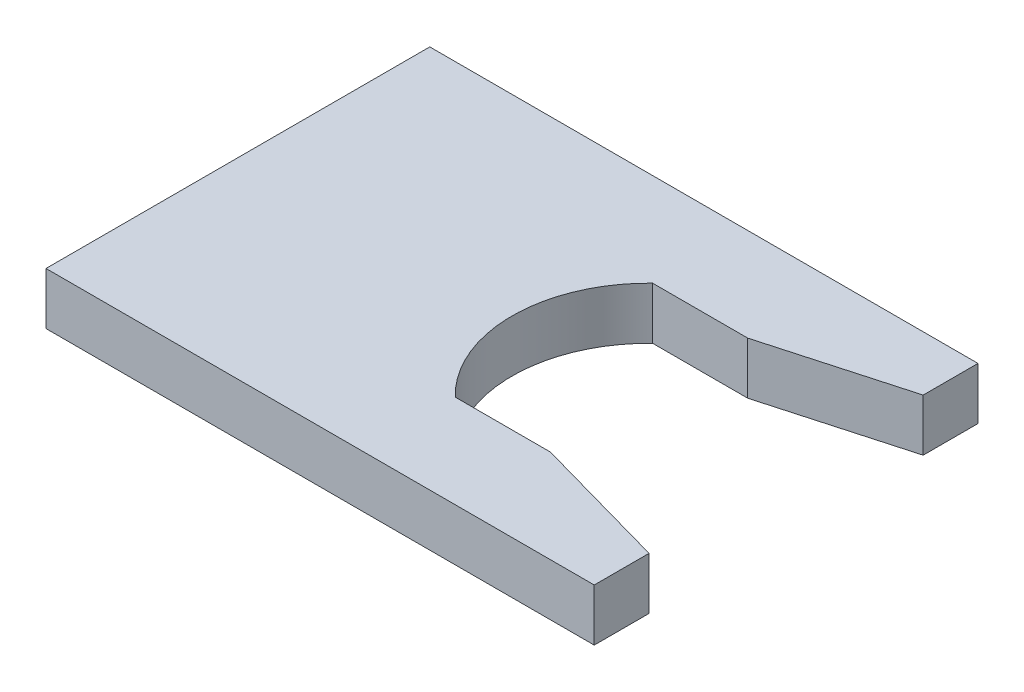
ISO-10303-21;
HEADER;
FILE_DESCRIPTION(('STEP AP214'),'2;1');
FILE_NAME('part.step','',(''),(''),'','','');
FILE_SCHEMA(('AUTOMOTIVE_DESIGN { 1 0 10303 214 1 1 1 1 }'));
ENDSEC;
DATA;
#1=APPLICATION_CONTEXT('core data for automotive mechanical design processes');
#2=APPLICATION_PROTOCOL_DEFINITION('international standard','automotive_design',2000,#1);
#3=PRODUCT_CONTEXT('',#1,'mechanical');
#4=PRODUCT('Part','Part','',(#3));
#5=PRODUCT_RELATED_PRODUCT_CATEGORY('part','',(#4));
#6=PRODUCT_DEFINITION_FORMATION('','',#4);
#7=PRODUCT_DEFINITION_CONTEXT('part definition',#1,'design');
#8=PRODUCT_DEFINITION('design','',#6,#7);
#9=PRODUCT_DEFINITION_SHAPE('','',#8);
#10=(LENGTH_UNIT() NAMED_UNIT(*) SI_UNIT(.MILLI.,.METRE.));
#11=(NAMED_UNIT(*) PLANE_ANGLE_UNIT() SI_UNIT($,.RADIAN.));
#12=(NAMED_UNIT(*) SI_UNIT($,.STERADIAN.) SOLID_ANGLE_UNIT());
#13=UNCERTAINTY_MEASURE_WITH_UNIT(LENGTH_MEASURE(1.E-05),#10,'distance_accuracy_value','');
#14=(GEOMETRIC_REPRESENTATION_CONTEXT(3) GLOBAL_UNCERTAINTY_ASSIGNED_CONTEXT((#13)) GLOBAL_UNIT_ASSIGNED_CONTEXT((#10,
#11,#12)) REPRESENTATION_CONTEXT('',''));
#15=CARTESIAN_POINT('',(0.,0.,0.));
#16=DIRECTION('',(0.,0.,1.));
#17=DIRECTION('',(1.,0.,0.));
#18=AXIS2_PLACEMENT_3D('',#15,#16,#17);
#19=CARTESIAN_POINT('',(3.72529029846191E-07,9.5,0.));
#20=DIRECTION('',(0.,1.,0.));
#21=DIRECTION('',(1.,0.,0.));
#22=AXIS2_PLACEMENT_3D('',#19,#20,#21);
#23=PLANE('',#22);
#24=DIRECTION('',(-0.962964019714182,0.,-0.269629925519971));
#25=VECTOR('',#24,1.);
#26=CARTESIAN_POINT('',(11.0719587946814,9.5,14.1001486264236));
#27=LINE('',#26,#25);
#28=CARTESIAN_POINT('',(50.0000007450581,9.5,25.000000372529));
#29=VERTEX_POINT('',#28);
#30=CARTESIAN_POINT('',(24.9999994145972,9.5,18.));
#31=VERTEX_POINT('',#30);
#32=EDGE_CURVE('E161',#29,#31,#27,.T.);
#33=ORIENTED_EDGE('',*,*,#32,.T.);
#34=DIRECTION('',(-1.,0.,0.));
#35=VECTOR('',#34,1.);
#36=CARTESIAN_POINT('',(25.,9.5,18.));
#37=LINE('',#36,#35);
#38=CARTESIAN_POINT('',(7.65064842710252,9.5,18.));
#39=VERTEX_POINT('',#38);
#40=EDGE_CURVE('E267',#31,#39,#37,.T.);
#41=ORIENTED_EDGE('',*,*,#40,.T.);
#42=CARTESIAN_POINT('',(25.,9.5,0.));
#43=DIRECTION('',(0.,-1.,0.));
#44=DIRECTION('',(-0.693974062915899,0.,-0.72));
#45=AXIS2_PLACEMENT_3D('',#42,#43,#44);
#46=CIRCLE('',#45,25.);
#47=CARTESIAN_POINT('',(7.65064842710252,9.5,-18.));
#48=VERTEX_POINT('',#47);
#49=EDGE_CURVE('E99',#39,#48,#46,.T.);
#50=ORIENTED_EDGE('',*,*,#49,.T.);
#51=DIRECTION('',(1.,0.,0.));
#52=VECTOR('',#51,1.);
#53=CARTESIAN_POINT('',(25.,9.5,-18.));
#54=LINE('',#53,#52);
#55=CARTESIAN_POINT('',(25.000000372529,9.5,-18.0000002682209));
#56=VERTEX_POINT('',#55);
#57=EDGE_CURVE('E11',#48,#56,#54,.T.);
#58=ORIENTED_EDGE('',*,*,#57,.T.);
#59=DIRECTION('',(0.962964019714182,0.,-0.269629925519971));
#60=VECTOR('',#59,1.);
#61=CARTESIAN_POINT('',(23.5719589809459,9.5,-17.6001486785776));
#62=LINE('',#61,#60);
#63=CARTESIAN_POINT('',(50.0000007450581,9.5,-25.000000372529));
#64=VERTEX_POINT('',#63);
#65=EDGE_CURVE('E256',#56,#64,#62,.T.);
#66=ORIENTED_EDGE('',*,*,#65,.T.);
#67=DIRECTION('',(-7.45058087447957E-08,0.,-1.));
#68=VECTOR('',#67,1.);
#69=CARTESIAN_POINT('',(50.0000007450581,9.5,-25.000000372529));
#70=LINE('',#69,#68);
#71=CARTESIAN_POINT('',(50.,9.5,-35.));
#72=VERTEX_POINT('',#71);
#73=EDGE_CURVE('E29',#64,#72,#70,.T.);
#74=ORIENTED_EDGE('',*,*,#73,.T.);
#75=DIRECTION('',(-1.,0.,0.));
#76=VECTOR('',#75,1.);
#77=CARTESIAN_POINT('',(50.,9.5,-35.));
#78=LINE('',#77,#76);
#79=CARTESIAN_POINT('',(-50.,9.5,-35.));
#80=VERTEX_POINT('',#79);
#81=EDGE_CURVE('E223',#72,#80,#78,.T.);
#82=ORIENTED_EDGE('',*,*,#81,.T.);
#83=DIRECTION('',(0.,0.,1.));
#84=VECTOR('',#83,1.);
#85=CARTESIAN_POINT('',(-50.,9.5,-35.));
#86=LINE('',#85,#84);
#87=CARTESIAN_POINT('',(-50.,9.5,35.));
#88=VERTEX_POINT('',#87);
#89=EDGE_CURVE('E177',#80,#88,#86,.T.);
#90=ORIENTED_EDGE('',*,*,#89,.T.);
#91=DIRECTION('',(1.,0.,0.));
#92=VECTOR('',#91,1.);
#93=CARTESIAN_POINT('',(-50.,9.5,35.));
#94=LINE('',#93,#92);
#95=CARTESIAN_POINT('',(50.,9.5,35.));
#96=VERTEX_POINT('',#95);
#97=EDGE_CURVE('E179',#88,#96,#94,.T.);
#98=ORIENTED_EDGE('',*,*,#97,.T.);
#99=DIRECTION('',(7.45058087447957E-08,0.,-1.));
#100=VECTOR('',#99,1.);
#101=CARTESIAN_POINT('',(50.,9.5,35.));
#102=LINE('',#101,#100);
#103=EDGE_CURVE('E308',#96,#29,#102,.T.);
#104=ORIENTED_EDGE('',*,*,#103,.T.);
#105=EDGE_LOOP('',(#33,#41,#50,#58,#66,#74,#82,#90,#98,#104));
#106=FACE_BOUND('',#105,.T.);
#107=ADVANCED_FACE('F17',(#106),#23,.T.);
#108=CARTESIAN_POINT('',(7.65064842710252,0.,-18.));
#109=DIRECTION('',(0.,0.,1.));
#110=DIRECTION('',(1.,0.,0.));
#111=AXIS2_PLACEMENT_3D('',#108,#109,#110);
#112=PLANE('',#111);
#113=DIRECTION('',(0.,1.,0.));
#114=VECTOR('',#113,1.);
#115=CARTESIAN_POINT('',(24.9999994145972,0.,-18.));
#116=LINE('',#115,#114);
#117=CARTESIAN_POINT('',(25.000000372529,0.,-18.0000002682209));
#118=VERTEX_POINT('',#117);
#119=EDGE_CURVE('E195',#118,#56,#116,.T.);
#120=ORIENTED_EDGE('',*,*,#119,.T.);
#121=ORIENTED_EDGE('',*,*,#57,.F.);
#122=DIRECTION('',(0.,1.,0.));
#123=VECTOR('',#122,1.);
#124=CARTESIAN_POINT('',(7.65064842710252,0.,-18.));
#125=LINE('',#124,#123);
#126=CARTESIAN_POINT('',(7.65064842710252,0.,-18.));
#127=VERTEX_POINT('',#126);
#128=EDGE_CURVE('E198',#127,#48,#125,.T.);
#129=ORIENTED_EDGE('',*,*,#128,.F.);
#130=DIRECTION('',(1.,0.,0.));
#131=VECTOR('',#130,1.);
#132=CARTESIAN_POINT('',(25.,0.,-18.));
#133=LINE('',#132,#131);
#134=EDGE_CURVE('E197',#127,#118,#133,.T.);
#135=ORIENTED_EDGE('',*,*,#134,.T.);
#136=EDGE_LOOP('',(#120,#121,#129,#135));
#137=FACE_BOUND('',#136,.T.);
#138=ADVANCED_FACE('F337',(#137),#112,.T.);
#139=CARTESIAN_POINT('',(50.0000007450581,0.,-25.000000372529));
#140=DIRECTION('',(1.,0.,-7.45058087447957E-08));
#141=DIRECTION('',(0.,-1.,0.));
#142=AXIS2_PLACEMENT_3D('',#139,#140,#141);
#143=PLANE('',#142);
#144=DIRECTION('',(-7.45058087447957E-08,0.,-1.));
#145=VECTOR('',#144,1.);
#146=CARTESIAN_POINT('',(50.0000007450581,0.,-25.000000372529));
#147=LINE('',#146,#145);
#148=CARTESIAN_POINT('',(50.0000007450581,0.,-25.000000372529));
#149=VERTEX_POINT('',#148);
#150=CARTESIAN_POINT('',(50.,0.,-35.));
#151=VERTEX_POINT('',#150);
#152=EDGE_CURVE('E210',#149,#151,#147,.T.);
#153=ORIENTED_EDGE('',*,*,#152,.T.);
#154=DIRECTION('',(0.,1.,0.));
#155=VECTOR('',#154,1.);
#156=CARTESIAN_POINT('',(50.,0.,-35.));
#157=LINE('',#156,#155);
#158=EDGE_CURVE('E229',#151,#72,#157,.T.);
#159=ORIENTED_EDGE('',*,*,#158,.T.);
#160=ORIENTED_EDGE('',*,*,#73,.F.);
#161=DIRECTION('',(0.,1.,0.));
#162=VECTOR('',#161,1.);
#163=CARTESIAN_POINT('',(50.0000007450581,0.,-25.000000372529));
#164=LINE('',#163,#162);
#165=EDGE_CURVE('E191',#149,#64,#164,.T.);
#166=ORIENTED_EDGE('',*,*,#165,.F.);
#167=EDGE_LOOP('',(#153,#159,#160,#166));
#168=FACE_BOUND('',#167,.T.);
#169=ADVANCED_FACE('F332',(#168),#143,.T.);
#170=CARTESIAN_POINT('',(50.,0.,-35.));
#171=DIRECTION('',(0.,0.,-1.));
#172=DIRECTION('',(0.,-1.,0.));
#173=AXIS2_PLACEMENT_3D('',#170,#171,#172);
#174=PLANE('',#173);
#175=DIRECTION('',(-1.,0.,0.));
#176=VECTOR('',#175,1.);
#177=CARTESIAN_POINT('',(50.,0.,-35.));
#178=LINE('',#177,#176);
#179=CARTESIAN_POINT('',(-50.,0.,-35.));
#180=VERTEX_POINT('',#179);
#181=EDGE_CURVE('E214',#151,#180,#178,.T.);
#182=ORIENTED_EDGE('',*,*,#181,.T.);
#183=DIRECTION('',(0.,1.,0.));
#184=VECTOR('',#183,1.);
#185=CARTESIAN_POINT('',(-50.,0.,-35.));
#186=LINE('',#185,#184);
#187=EDGE_CURVE('E222',#180,#80,#186,.T.);
#188=ORIENTED_EDGE('',*,*,#187,.T.);
#189=ORIENTED_EDGE('',*,*,#81,.F.);
#190=ORIENTED_EDGE('',*,*,#158,.F.);
#191=EDGE_LOOP('',(#182,#188,#189,#190));
#192=FACE_BOUND('',#191,.T.);
#193=ADVANCED_FACE('F327',(#192),#174,.T.);
#194=CARTESIAN_POINT('',(-50.,0.,-35.));
#195=DIRECTION('',(-1.,0.,0.));
#196=DIRECTION('',(0.,0.,1.));
#197=AXIS2_PLACEMENT_3D('',#194,#195,#196);
#198=PLANE('',#197);
#199=DIRECTION('',(0.,0.,1.));
#200=VECTOR('',#199,1.);
#201=CARTESIAN_POINT('',(-50.,0.,-35.));
#202=LINE('',#201,#200);
#203=CARTESIAN_POINT('',(-50.,0.,35.));
#204=VERTEX_POINT('',#203);
#205=EDGE_CURVE('E233',#180,#204,#202,.T.);
#206=ORIENTED_EDGE('',*,*,#205,.T.);
#207=DIRECTION('',(0.,1.,0.));
#208=VECTOR('',#207,1.);
#209=CARTESIAN_POINT('',(-50.,0.,35.));
#210=LINE('',#209,#208);
#211=EDGE_CURVE('E175',#204,#88,#210,.T.);
#212=ORIENTED_EDGE('',*,*,#211,.T.);
#213=ORIENTED_EDGE('',*,*,#89,.F.);
#214=ORIENTED_EDGE('',*,*,#187,.F.);
#215=EDGE_LOOP('',(#206,#212,#213,#214));
#216=FACE_BOUND('',#215,.T.);
#217=ADVANCED_FACE('F323',(#216),#198,.T.);
#218=CARTESIAN_POINT('',(-50.,0.,35.));
#219=DIRECTION('',(0.,0.,1.));
#220=DIRECTION('',(1.,0.,0.));
#221=AXIS2_PLACEMENT_3D('',#218,#219,#220);
#222=PLANE('',#221);
#223=DIRECTION('',(1.,0.,0.));
#224=VECTOR('',#223,1.);
#225=CARTESIAN_POINT('',(-50.,0.,35.));
#226=LINE('',#225,#224);
#227=CARTESIAN_POINT('',(50.,0.,35.));
#228=VERTEX_POINT('',#227);
#229=EDGE_CURVE('E259',#204,#228,#226,.T.);
#230=ORIENTED_EDGE('',*,*,#229,.T.);
#231=DIRECTION('',(0.,1.,0.));
#232=VECTOR('',#231,1.);
#233=CARTESIAN_POINT('',(50.,0.,35.));
#234=LINE('',#233,#232);
#235=EDGE_CURVE('E84',#228,#96,#234,.T.);
#236=ORIENTED_EDGE('',*,*,#235,.T.);
#237=ORIENTED_EDGE('',*,*,#97,.F.);
#238=ORIENTED_EDGE('',*,*,#211,.F.);
#239=EDGE_LOOP('',(#230,#236,#237,#238));
#240=FACE_BOUND('',#239,.T.);
#241=ADVANCED_FACE('F407',(#240),#222,.T.);
#242=CARTESIAN_POINT('',(50.,0.,35.));
#243=DIRECTION('',(1.,0.,7.45058087447957E-08));
#244=DIRECTION('',(0.,-1.,0.));
#245=AXIS2_PLACEMENT_3D('',#242,#243,#244);
#246=PLANE('',#245);
#247=DIRECTION('',(7.45058087447957E-08,0.,-1.));
#248=VECTOR('',#247,1.);
#249=CARTESIAN_POINT('',(50.,0.,35.));
#250=LINE('',#249,#248);
#251=CARTESIAN_POINT('',(50.0000007450581,0.,25.000000372529));
#252=VERTEX_POINT('',#251);
#253=EDGE_CURVE('E218',#228,#252,#250,.T.);
#254=ORIENTED_EDGE('',*,*,#253,.T.);
#255=DIRECTION('',(0.,1.,0.));
#256=VECTOR('',#255,1.);
#257=CARTESIAN_POINT('',(50.0000007450581,0.,25.000000372529));
#258=LINE('',#257,#256);
#259=EDGE_CURVE('E21',#252,#29,#258,.T.);
#260=ORIENTED_EDGE('',*,*,#259,.T.);
#261=ORIENTED_EDGE('',*,*,#103,.F.);
#262=ORIENTED_EDGE('',*,*,#235,.F.);
#263=EDGE_LOOP('',(#254,#260,#261,#262));
#264=FACE_BOUND('',#263,.T.);
#265=ADVANCED_FACE('F399',(#264),#246,.T.);
#266=CARTESIAN_POINT('',(25.,0.,0.));
#267=DIRECTION('',(0.,1.,0.));
#268=DIRECTION('',(-0.693974062915899,0.,-0.72));
#269=AXIS2_PLACEMENT_3D('',#266,#267,#268);
#270=CYLINDRICAL_SURFACE('',#269,25.);
#271=CARTESIAN_POINT('',(25.,0.,0.));
#272=DIRECTION('',(0.,1.,0.));
#273=DIRECTION('',(-0.693974062915899,0.,-0.72));
#274=AXIS2_PLACEMENT_3D('',#271,#272,#273);
#275=CIRCLE('',#274,25.);
#276=CARTESIAN_POINT('',(7.65064842710252,0.,18.));
#277=VERTEX_POINT('',#276);
#278=EDGE_CURVE('E192',#127,#277,#275,.T.);
#279=ORIENTED_EDGE('',*,*,#278,.F.);
#280=ORIENTED_EDGE('',*,*,#128,.T.);
#281=ORIENTED_EDGE('',*,*,#49,.F.);
#282=DIRECTION('',(0.,1.,0.));
#283=VECTOR('',#282,1.);
#284=CARTESIAN_POINT('',(7.65064842710252,0.,18.));
#285=LINE('',#284,#283);
#286=EDGE_CURVE('E273',#277,#39,#285,.T.);
#287=ORIENTED_EDGE('',*,*,#286,.F.);
#288=EDGE_LOOP('',(#279,#280,#281,#287));
#289=FACE_BOUND('',#288,.T.);
#290=ADVANCED_FACE('F339',(#289),#270,.F.);
#291=CARTESIAN_POINT('',(3.72529029846191E-07,0.,0.));
#292=DIRECTION('',(0.,1.,0.));
#293=DIRECTION('',(1.,0.,0.));
#294=AXIS2_PLACEMENT_3D('',#291,#292,#293);
#295=PLANE('',#294);
#296=CARTESIAN_POINT('',(-40.,0.,25.));
#297=DIRECTION('',(0.,1.,0.));
#298=DIRECTION('',(1.,0.,0.));
#299=AXIS2_PLACEMENT_3D('',#296,#297,#298);
#300=CIRCLE('',#299,1.5);
#301=CARTESIAN_POINT('',(-38.5,0.,25.));
#302=VERTEX_POINT('',#301);
#303=EDGE_CURVE('E186',#302,#302,#300,.T.);
#304=ORIENTED_EDGE('',*,*,#303,.T.);
#305=EDGE_LOOP('',(#304));
#306=FACE_BOUND('',#305,.T.);
#307=CARTESIAN_POINT('',(-40.,0.,-25.));
#308=DIRECTION('',(0.,1.,0.));
#309=DIRECTION('',(1.,0.,0.));
#310=AXIS2_PLACEMENT_3D('',#307,#308,#309);
#311=CIRCLE('',#310,1.5);
#312=CARTESIAN_POINT('',(-38.5,0.,-25.));
#313=VERTEX_POINT('',#312);
#314=EDGE_CURVE('E166',#313,#313,#311,.T.);
#315=ORIENTED_EDGE('',*,*,#314,.T.);
#316=EDGE_LOOP('',(#315));
#317=FACE_BOUND('',#316,.T.);
#318=DIRECTION('',(0.962964019714182,0.,0.269629925519971));
#319=VECTOR('',#318,1.);
#320=CARTESIAN_POINT('',(11.0719587946814,0.,14.1001486264236));
#321=LINE('',#320,#319);
#322=CARTESIAN_POINT('',(25.000000372529,0.,18.0000002682209));
#323=VERTEX_POINT('',#322);
#324=EDGE_CURVE('E284',#323,#252,#321,.T.);
#325=ORIENTED_EDGE('',*,*,#324,.T.);
#326=ORIENTED_EDGE('',*,*,#253,.F.);
#327=ORIENTED_EDGE('',*,*,#229,.F.);
#328=ORIENTED_EDGE('',*,*,#205,.F.);
#329=ORIENTED_EDGE('',*,*,#181,.F.);
#330=ORIENTED_EDGE('',*,*,#152,.F.);
#331=DIRECTION('',(-0.962964019714182,0.,0.269629925519971));
#332=VECTOR('',#331,1.);
#333=CARTESIAN_POINT('',(23.5719589809459,0.,-17.6001486785776));
#334=LINE('',#333,#332);
#335=EDGE_CURVE('E190',#149,#118,#334,.T.);
#336=ORIENTED_EDGE('',*,*,#335,.T.);
#337=ORIENTED_EDGE('',*,*,#134,.F.);
#338=ORIENTED_EDGE('',*,*,#278,.T.);
#339=DIRECTION('',(1.,0.,0.));
#340=VECTOR('',#339,1.);
#341=CARTESIAN_POINT('',(25.,0.,18.));
#342=LINE('',#341,#340);
#343=EDGE_CURVE('E276',#277,#323,#342,.T.);
#344=ORIENTED_EDGE('',*,*,#343,.T.);
#345=EDGE_LOOP('',(#325,#326,#327,#328,#329,#330,#336,#337,#338,#344));
#346=FACE_BOUND('',#345,.T.);
#347=ADVANCED_FACE('F19',(#306,#317,#346),#295,.F.);
#348=CARTESIAN_POINT('',(42.3493515728975,0.,18.));
#349=DIRECTION('',(0.,0.,-1.));
#350=DIRECTION('',(-1.,0.,0.));
#351=AXIS2_PLACEMENT_3D('',#348,#349,#350);
#352=PLANE('',#351);
#353=DIRECTION('',(0.,-1.,0.));
#354=VECTOR('',#353,1.);
#355=CARTESIAN_POINT('',(24.9999994145972,0.,18.));
#356=LINE('',#355,#354);
#357=EDGE_CURVE('E286',#31,#323,#356,.T.);
#358=ORIENTED_EDGE('',*,*,#357,.T.);
#359=ORIENTED_EDGE('',*,*,#343,.F.);
#360=ORIENTED_EDGE('',*,*,#286,.T.);
#361=ORIENTED_EDGE('',*,*,#40,.F.);
#362=EDGE_LOOP('',(#358,#359,#360,#361));
#363=FACE_BOUND('',#362,.T.);
#364=ADVANCED_FACE('F314',(#363),#352,.T.);
#365=CARTESIAN_POINT('',(50.0000007450581,0.,-25.000000372529));
#366=DIRECTION('',(-0.269629925519971,0.,-0.962964019714182));
#367=DIRECTION('',(-0.962964019714182,0.,0.269629925519971));
#368=AXIS2_PLACEMENT_3D('',#365,#366,#367);
#369=PLANE('',#368);
#370=ORIENTED_EDGE('',*,*,#65,.F.);
#371=ORIENTED_EDGE('',*,*,#119,.F.);
#372=ORIENTED_EDGE('',*,*,#335,.F.);
#373=ORIENTED_EDGE('',*,*,#165,.T.);
#374=EDGE_LOOP('',(#370,#371,#372,#373));
#375=FACE_BOUND('',#374,.T.);
#376=ADVANCED_FACE('F336',(#375),#369,.F.);
#377=CARTESIAN_POINT('',(25.000000372529,0.,18.0000002682209));
#378=DIRECTION('',(-0.269629925519971,0.,0.962964019714182));
#379=DIRECTION('',(0.,1.,0.));
#380=AXIS2_PLACEMENT_3D('',#377,#378,#379);
#381=PLANE('',#380);
#382=ORIENTED_EDGE('',*,*,#32,.F.);
#383=ORIENTED_EDGE('',*,*,#259,.F.);
#384=ORIENTED_EDGE('',*,*,#324,.F.);
#385=ORIENTED_EDGE('',*,*,#357,.F.);
#386=EDGE_LOOP('',(#382,#383,#384,#385));
#387=FACE_BOUND('',#386,.T.);
#388=ADVANCED_FACE('F317',(#387),#381,.F.);
#389=CARTESIAN_POINT('',(-40.,0.5,-25.));
#390=DIRECTION('',(0.,-1.,0.));
#391=DIRECTION('',(0.,0.,-1.));
#392=AXIS2_PLACEMENT_3D('',#389,#390,#391);
#393=PLANE('',#392);
#394=CARTESIAN_POINT('',(-40.0000005960464,0.5,-25.000000372529));
#395=DIRECTION('',(0.,1.,0.));
#396=DIRECTION('',(1.,0.,0.));
#397=AXIS2_PLACEMENT_3D('',#394,#395,#396);
#398=CIRCLE('',#397,0.4847);
#399=CARTESIAN_POINT('',(-40.4847005960465,0.5,-25.000000372529));
#400=VERTEX_POINT('',#399);
#401=EDGE_CURVE('E246',#400,#400,#398,.T.);
#402=ORIENTED_EDGE('',*,*,#401,.T.);
#403=EDGE_LOOP('',(#402));
#404=FACE_BOUND('',#403,.T.);
#405=CARTESIAN_POINT('',(-40.,0.5,-25.));
#406=DIRECTION('',(0.,1.,0.));
#407=DIRECTION('',(-1.,0.,0.));
#408=AXIS2_PLACEMENT_3D('',#405,#406,#407);
#409=CIRCLE('',#408,0.633974596215561);
#410=CARTESIAN_POINT('',(-39.3660254037844,0.5,-25.));
#411=VERTEX_POINT('',#410);
#412=EDGE_CURVE('E152',#411,#411,#409,.T.);
#413=ORIENTED_EDGE('',*,*,#412,.F.);
#414=EDGE_LOOP('',(#413));
#415=FACE_BOUND('',#414,.T.);
#416=ADVANCED_FACE('F416',(#404,#415),#393,.T.);
#417=CARTESIAN_POINT('',(-39.3660254037844,0.5,-25.));
#418=CARTESIAN_POINT('',(-39.3660254037844,0.5,-24.3660254037844));
#419=CARTESIAN_POINT('',(-40.,0.5,-24.3660254037844));
#420=CARTESIAN_POINT('',(-40.6339745962156,0.5,-24.3660254037844));
#421=CARTESIAN_POINT('',(-40.6339745962156,0.5,-25.));
#422=CARTESIAN_POINT('',(-40.6339745962156,0.5,-25.6339745962156));
#423=CARTESIAN_POINT('',(-40.,0.5,-25.6339745962156));
#424=CARTESIAN_POINT('',(-39.3660254037844,0.5,-25.6339745962156));
#425=CARTESIAN_POINT('',(-39.3660254037844,0.5,-25.));
#426=CARTESIAN_POINT('',(-38.7886751345948,0.5,-25.));
#427=CARTESIAN_POINT('',(-38.7886751345948,0.5,-23.7886751345948));
#428=CARTESIAN_POINT('',(-40.,0.5,-23.7886751345948));
#429=CARTESIAN_POINT('',(-41.2113248654052,0.5,-23.7886751345948));
#430=CARTESIAN_POINT('',(-41.2113248654052,0.5,-25.));
#431=CARTESIAN_POINT('',(-41.2113248654052,0.5,-26.2113248654052));
#432=CARTESIAN_POINT('',(-40.,0.5,-26.2113248654052));
#433=CARTESIAN_POINT('',(-38.7886751345948,0.5,-26.2113248654052));
#434=CARTESIAN_POINT('',(-38.7886751345948,0.5,-25.));
#435=CARTESIAN_POINT('',(-38.5,0.,-25.));
#436=CARTESIAN_POINT('',(-38.5,0.,-23.5));
#437=CARTESIAN_POINT('',(-40.,0.,-23.5));
#438=CARTESIAN_POINT('',(-41.5,0.,-23.5));
#439=CARTESIAN_POINT('',(-41.5,0.,-25.));
#440=CARTESIAN_POINT('',(-41.5,0.,-26.5));
#441=CARTESIAN_POINT('',(-40.,0.,-26.5));
#442=CARTESIAN_POINT('',(-38.5,0.,-26.5));
#443=CARTESIAN_POINT('',(-38.5,0.,-25.));
#444=(BOUNDED_SURFACE() B_SPLINE_SURFACE(2,2,((#417,#418,#419,#420,#421,#422,#423,#424,#425),
(#426,#427,#428,#429,#430,#431,#432,#433,#434),(#435,#436,#437,#438,#439,#440,#441,#442,#443)),
.UNSPECIFIED.,.F.,.T.,.F.) B_SPLINE_SURFACE_WITH_KNOTS((3,3),(3,2,2,2,3),(-1.5707963267949,
-0.523598775598297),(-3.14159265358979,-1.5707963267949,0.,1.5707963267949,3.14159265358979),
.UNSPECIFIED.) GEOMETRIC_REPRESENTATION_ITEM() RATIONAL_B_SPLINE_SURFACE(((1.,0.707106781186548,
1.,0.707106781186548,1.,0.707106781186548,1.,0.707106781186548,1.),(0.866025403784404,
0.61237243569577,0.866025403784404,0.61237243569577,0.866025403784404,0.61237243569577,
0.866025403784404,0.61237243569577,0.866025403784404),(1.,0.707106781186548,1.,
0.707106781186548,1.,0.707106781186548,1.,0.707106781186548,1.))) REPRESENTATION_ITEM('') SURFACE());
#445=CARTESIAN_POINT('',(-39.3660254037844,-0.5,-25.));
#446=DIRECTION('',(0.,0.,1.));
#447=DIRECTION('',(1.,0.,0.));
#448=AXIS2_PLACEMENT_3D('',#445,#446,#447);
#449=CIRCLE('',#448,1.);
#450=EDGE_CURVE('E160',#313,#411,#449,.T.);
#451=ORIENTED_EDGE('',*,*,#314,.F.);
#452=ORIENTED_EDGE('',*,*,#450,.T.);
#453=ORIENTED_EDGE('',*,*,#412,.T.);
#454=ORIENTED_EDGE('',*,*,#450,.F.);
#455=EDGE_LOOP('',(#451,#452,#453,#454));
#456=FACE_BOUND('',#455,.T.);
#457=ADVANCED_FACE('F156',(#456),#444,.T.);
#458=CARTESIAN_POINT('',(-40.,0.5,25.));
#459=DIRECTION('',(0.,-1.,0.));
#460=DIRECTION('',(0.,0.,-1.));
#461=AXIS2_PLACEMENT_3D('',#458,#459,#460);
#462=PLANE('',#461);
#463=CARTESIAN_POINT('',(-40.0000005960464,0.5,25.000000372529));
#464=DIRECTION('',(0.,1.,0.));
#465=DIRECTION('',(1.,0.,0.));
#466=AXIS2_PLACEMENT_3D('',#463,#464,#465);
#467=CIRCLE('',#466,0.4847);
#468=CARTESIAN_POINT('',(-40.4847005960465,0.5,25.000000372529));
#469=VERTEX_POINT('',#468);
#470=EDGE_CURVE('E240',#469,#469,#467,.T.);
#471=ORIENTED_EDGE('',*,*,#470,.T.);
#472=EDGE_LOOP('',(#471));
#473=FACE_BOUND('',#472,.T.);
#474=CARTESIAN_POINT('',(-40.,0.5,25.));
#475=DIRECTION('',(0.,1.,0.));
#476=DIRECTION('',(-1.,0.,0.));
#477=AXIS2_PLACEMENT_3D('',#474,#475,#476);
#478=CIRCLE('',#477,0.633974596215561);
#479=CARTESIAN_POINT('',(-39.3660254037844,0.5,25.));
#480=VERTEX_POINT('',#479);
#481=EDGE_CURVE('E184',#480,#480,#478,.T.);
#482=ORIENTED_EDGE('',*,*,#481,.F.);
#483=EDGE_LOOP('',(#482));
#484=FACE_BOUND('',#483,.T.);
#485=ADVANCED_FACE('F422',(#473,#484),#462,.T.);
#486=CARTESIAN_POINT('',(-39.3660254037844,0.5,25.));
#487=CARTESIAN_POINT('',(-39.3660254037844,0.5,25.6339745962156));
#488=CARTESIAN_POINT('',(-40.,0.5,25.6339745962156));
#489=CARTESIAN_POINT('',(-40.6339745962156,0.5,25.6339745962156));
#490=CARTESIAN_POINT('',(-40.6339745962156,0.5,25.));
#491=CARTESIAN_POINT('',(-40.6339745962156,0.5,24.3660254037844));
#492=CARTESIAN_POINT('',(-40.,0.5,24.3660254037844));
#493=CARTESIAN_POINT('',(-39.3660254037844,0.5,24.3660254037844));
#494=CARTESIAN_POINT('',(-39.3660254037844,0.5,25.));
#495=CARTESIAN_POINT('',(-38.7886751345948,0.5,25.));
#496=CARTESIAN_POINT('',(-38.7886751345948,0.5,26.2113248654052));
#497=CARTESIAN_POINT('',(-40.,0.5,26.2113248654052));
#498=CARTESIAN_POINT('',(-41.2113248654052,0.5,26.2113248654052));
#499=CARTESIAN_POINT('',(-41.2113248654052,0.5,25.));
#500=CARTESIAN_POINT('',(-41.2113248654052,0.5,23.7886751345948));
#501=CARTESIAN_POINT('',(-40.,0.5,23.7886751345948));
#502=CARTESIAN_POINT('',(-38.7886751345948,0.5,23.7886751345948));
#503=CARTESIAN_POINT('',(-38.7886751345948,0.5,25.));
#504=CARTESIAN_POINT('',(-38.5,0.,25.));
#505=CARTESIAN_POINT('',(-38.5,0.,26.5));
#506=CARTESIAN_POINT('',(-40.,0.,26.5));
#507=CARTESIAN_POINT('',(-41.5,0.,26.5));
#508=CARTESIAN_POINT('',(-41.5,0.,25.));
#509=CARTESIAN_POINT('',(-41.5,0.,23.5));
#510=CARTESIAN_POINT('',(-40.,0.,23.5));
#511=CARTESIAN_POINT('',(-38.5,0.,23.5));
#512=CARTESIAN_POINT('',(-38.5,0.,25.));
#513=(BOUNDED_SURFACE() B_SPLINE_SURFACE(2,2,((#486,#487,#488,#489,#490,#491,#492,#493,#494),
(#495,#496,#497,#498,#499,#500,#501,#502,#503),(#504,#505,#506,#507,#508,#509,#510,#511,#512)),
.UNSPECIFIED.,.F.,.T.,.F.) B_SPLINE_SURFACE_WITH_KNOTS((3,3),(3,2,2,2,3),(-1.5707963267949,
-0.523598775598297),(-3.14159265358979,-1.5707963267949,0.,1.5707963267949,3.14159265358979),
.UNSPECIFIED.) GEOMETRIC_REPRESENTATION_ITEM() RATIONAL_B_SPLINE_SURFACE(((1.,0.707106781186548,
1.,0.707106781186548,1.,0.707106781186548,1.,0.707106781186548,1.),(0.866025403784404,
0.61237243569577,0.866025403784404,0.61237243569577,0.866025403784404,0.61237243569577,
0.866025403784404,0.61237243569577,0.866025403784404),(1.,0.707106781186548,1.,
0.707106781186548,1.,0.707106781186548,1.,0.707106781186548,1.))) REPRESENTATION_ITEM('') SURFACE());
#514=CARTESIAN_POINT('',(-39.3660254037844,-0.5,25.));
#515=DIRECTION('',(0.,0.,1.));
#516=DIRECTION('',(1.,0.,0.));
#517=AXIS2_PLACEMENT_3D('',#514,#515,#516);
#518=CIRCLE('',#517,1.);
#519=EDGE_CURVE('E185',#302,#480,#518,.T.);
#520=ORIENTED_EDGE('',*,*,#303,.F.);
#521=ORIENTED_EDGE('',*,*,#519,.T.);
#522=ORIENTED_EDGE('',*,*,#481,.T.);
#523=ORIENTED_EDGE('',*,*,#519,.F.);
#524=EDGE_LOOP('',(#520,#521,#522,#523));
#525=FACE_BOUND('',#524,.T.);
#526=ADVANCED_FACE('F419',(#525),#513,.T.);
#527=CARTESIAN_POINT('',(-40.0000005960464,4.5,25.000000372529));
#528=DIRECTION('',(0.,-1.,0.));
#529=DIRECTION('',(0.,0.,-1.));
#530=AXIS2_PLACEMENT_3D('',#527,#528,#529);
#531=PLANE('',#530);
#532=CARTESIAN_POINT('',(-40.0000005960464,4.5,25.000000372529));
#533=DIRECTION('',(0.,1.,0.));
#534=DIRECTION('',(1.,0.,0.));
#535=AXIS2_PLACEMENT_3D('',#532,#533,#534);
#536=CIRCLE('',#535,0.4847);
#537=CARTESIAN_POINT('',(-40.4847005960465,4.5,25.000000372529));
#538=VERTEX_POINT('',#537);
#539=EDGE_CURVE('E305',#538,#538,#536,.T.);
#540=ORIENTED_EDGE('',*,*,#539,.F.);
#541=EDGE_LOOP('',(#540));
#542=FACE_BOUND('',#541,.T.);
#543=ADVANCED_FACE('F424',(#542),#531,.T.);
#544=CARTESIAN_POINT('',(-40.0000005960464,0.,25.000000372529));
#545=DIRECTION('',(0.,1.,0.));
#546=DIRECTION('',(1.,0.,0.));
#547=AXIS2_PLACEMENT_3D('',#544,#545,#546);
#548=CYLINDRICAL_SURFACE('',#547,0.4847);
#549=ORIENTED_EDGE('',*,*,#470,.F.);
#550=DIRECTION('',(0.,1.,0.));
#551=VECTOR('',#550,1.);
#552=CARTESIAN_POINT('',(-40.4847005960465,0.,25.000000372529));
#553=LINE('',#552,#551);
#554=EDGE_CURVE('E172',#469,#538,#553,.T.);
#555=ORIENTED_EDGE('',*,*,#554,.T.);
#556=ORIENTED_EDGE('',*,*,#539,.T.);
#557=ORIENTED_EDGE('',*,*,#554,.F.);
#558=EDGE_LOOP('',(#549,#555,#556,#557));
#559=FACE_BOUND('',#558,.T.);
#560=ADVANCED_FACE('F436',(#559),#548,.F.);
#561=CARTESIAN_POINT('',(-40.0000005960464,4.5,-25.000000372529));
#562=DIRECTION('',(0.,-1.,0.));
#563=DIRECTION('',(0.,0.,-1.));
#564=AXIS2_PLACEMENT_3D('',#561,#562,#563);
#565=PLANE('',#564);
#566=CARTESIAN_POINT('',(-40.0000005960464,4.5,-25.000000372529));
#567=DIRECTION('',(0.,1.,0.));
#568=DIRECTION('',(1.,0.,0.));
#569=AXIS2_PLACEMENT_3D('',#566,#567,#568);
#570=CIRCLE('',#569,0.4847);
#571=CARTESIAN_POINT('',(-40.4847005960465,4.5,-25.000000372529));
#572=VERTEX_POINT('',#571);
#573=EDGE_CURVE('E232',#572,#572,#570,.T.);
#574=ORIENTED_EDGE('',*,*,#573,.F.);
#575=EDGE_LOOP('',(#574));
#576=FACE_BOUND('',#575,.T.);
#577=ADVANCED_FACE('F450',(#576),#565,.T.);
#578=CARTESIAN_POINT('',(-40.0000005960464,0.,-25.000000372529));
#579=DIRECTION('',(0.,1.,0.));
#580=DIRECTION('',(1.,0.,0.));
#581=AXIS2_PLACEMENT_3D('',#578,#579,#580);
#582=CYLINDRICAL_SURFACE('',#581,0.4847);
#583=ORIENTED_EDGE('',*,*,#401,.F.);
#584=DIRECTION('',(0.,1.,0.));
#585=VECTOR('',#584,1.);
#586=CARTESIAN_POINT('',(-40.4847005960465,0.,-25.000000372529));
#587=LINE('',#586,#585);
#588=EDGE_CURVE('E236',#400,#572,#587,.T.);
#589=ORIENTED_EDGE('',*,*,#588,.T.);
#590=ORIENTED_EDGE('',*,*,#573,.T.);
#591=ORIENTED_EDGE('',*,*,#588,.F.);
#592=EDGE_LOOP('',(#583,#589,#590,#591));
#593=FACE_BOUND('',#592,.T.);
#594=ADVANCED_FACE('F455',(#593),#582,.F.);
#595=CLOSED_SHELL('',(#107,#138,#169,#193,#217,#241,#265,#290,#347,#364,#376,#388,#416,#457,
#485,#526,#543,#560,#577,#594));
#596=MANIFOLD_SOLID_BREP('B1',#595);
#597=ADVANCED_BREP_SHAPE_REPRESENTATION('',(#18,#596),#14);
#598=SHAPE_DEFINITION_REPRESENTATION(#9,#597);
ENDSEC;
END-ISO-10303-21;
